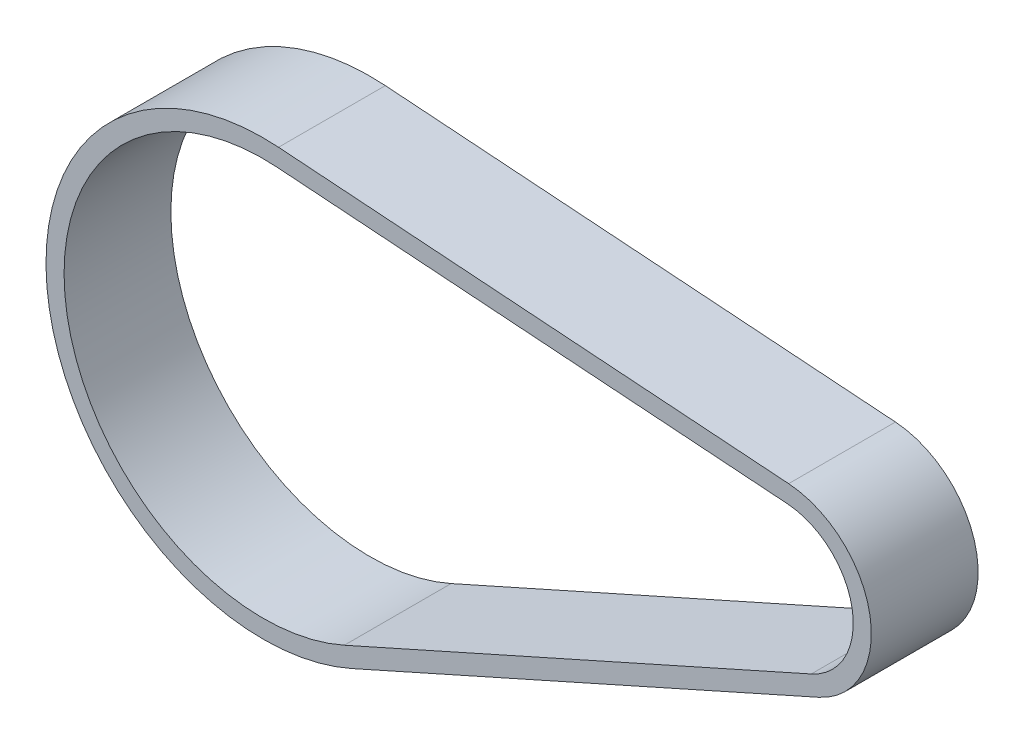
ISO-10303-21;
HEADER;
FILE_DESCRIPTION(('STEP AP214'),'2;1');
FILE_NAME('part.step','',(''),(''),'','','');
FILE_SCHEMA(('AUTOMOTIVE_DESIGN { 1 0 10303 214 1 1 1 1 }'));
ENDSEC;
DATA;
#1=APPLICATION_CONTEXT('core data for automotive mechanical design processes');
#2=APPLICATION_PROTOCOL_DEFINITION('international standard','automotive_design',2000,#1);
#3=PRODUCT_CONTEXT('',#1,'mechanical');
#4=PRODUCT('Part','Part','',(#3));
#5=PRODUCT_RELATED_PRODUCT_CATEGORY('part','',(#4));
#6=PRODUCT_DEFINITION_FORMATION('','',#4);
#7=PRODUCT_DEFINITION_CONTEXT('part definition',#1,'design');
#8=PRODUCT_DEFINITION('design','',#6,#7);
#9=PRODUCT_DEFINITION_SHAPE('','',#8);
#10=(LENGTH_UNIT() NAMED_UNIT(*) SI_UNIT(.MILLI.,.METRE.));
#11=(NAMED_UNIT(*) PLANE_ANGLE_UNIT() SI_UNIT($,.RADIAN.));
#12=(NAMED_UNIT(*) SI_UNIT($,.STERADIAN.) SOLID_ANGLE_UNIT());
#13=UNCERTAINTY_MEASURE_WITH_UNIT(LENGTH_MEASURE(1.E-05),#10,'distance_accuracy_value','');
#14=(GEOMETRIC_REPRESENTATION_CONTEXT(3) GLOBAL_UNCERTAINTY_ASSIGNED_CONTEXT((#13)) GLOBAL_UNIT_ASSIGNED_CONTEXT((#10,
#11,#12)) REPRESENTATION_CONTEXT('',''));
#15=CARTESIAN_POINT('',(0.,0.,0.));
#16=DIRECTION('',(0.,0.,1.));
#17=DIRECTION('',(1.,0.,0.));
#18=AXIS2_PLACEMENT_3D('',#15,#16,#17);
#19=CARTESIAN_POINT('',(0.,0.,-15.));
#20=DIRECTION('',(0.,0.,1.));
#21=DIRECTION('',(1.,0.,0.));
#22=AXIS2_PLACEMENT_3D('',#19,#20,#21);
#23=CYLINDRICAL_SURFACE('',#22,30.5);
#24=CARTESIAN_POINT('',(0.,0.,0.));
#25=DIRECTION('',(0.,0.,1.));
#26=DIRECTION('',(-1.,0.,0.));
#27=AXIS2_PLACEMENT_3D('',#24,#25,#26);
#28=CIRCLE('',#27,30.5);
#29=CARTESIAN_POINT('',(2.16385984295475,30.423144324347,0.));
#30=VERTEX_POINT('',#29);
#31=CARTESIAN_POINT('',(12.4386913090696,-27.8483205690698,0.));
#32=VERTEX_POINT('',#31);
#33=EDGE_CURVE('E154',#30,#32,#28,.T.);
#34=ORIENTED_EDGE('',*,*,#33,.F.);
#35=DIRECTION('',(0.,0.,1.));
#36=VECTOR('',#35,1.);
#37=CARTESIAN_POINT('',(2.16385984295475,30.423144324347,-15.));
#38=LINE('',#37,#36);
#39=CARTESIAN_POINT('',(2.16385984295475,30.423144324347,-15.));
#40=VERTEX_POINT('',#39);
#41=EDGE_CURVE('E12',#40,#30,#38,.T.);
#42=ORIENTED_EDGE('',*,*,#41,.F.);
#43=CARTESIAN_POINT('',(0.,0.,-15.));
#44=DIRECTION('',(0.,0.,1.));
#45=DIRECTION('',(-1.,0.,0.));
#46=AXIS2_PLACEMENT_3D('',#43,#44,#45);
#47=CIRCLE('',#46,30.5);
#48=CARTESIAN_POINT('',(12.4386913090696,-27.8483205690698,-15.));
#49=VERTEX_POINT('',#48);
#50=EDGE_CURVE('E158',#40,#49,#47,.T.);
#51=ORIENTED_EDGE('',*,*,#50,.T.);
#52=DIRECTION('',(0.,0.,1.));
#53=VECTOR('',#52,1.);
#54=CARTESIAN_POINT('',(12.4386913090696,-27.8483205690698,-15.));
#55=LINE('',#54,#53);
#56=EDGE_CURVE('E59',#49,#32,#55,.T.);
#57=ORIENTED_EDGE('',*,*,#56,.T.);
#58=EDGE_LOOP('',(#34,#42,#51,#57));
#59=FACE_BOUND('',#58,.T.);
#60=ADVANCED_FACE('F56',(#59),#23,.T.);
#61=CARTESIAN_POINT('',(2.16385984295475,30.423144324347,-15.));
#62=DIRECTION('',(0.0709462243591721,0.997480141781869,0.));
#63=DIRECTION('',(-0.997480141781869,0.0709462243591721,0.));
#64=AXIS2_PLACEMENT_3D('',#61,#62,#63);
#65=PLANE('',#64);
#66=DIRECTION('',(-0.997480141781869,0.0709462243591721,0.));
#67=VECTOR('',#66,1.);
#68=CARTESIAN_POINT('',(2.16385984295475,30.423144324347,0.));
#69=LINE('',#68,#67);
#70=CARTESIAN_POINT('',(73.8118419150438,25.3271493285088,0.));
#71=VERTEX_POINT('',#70);
#72=EDGE_CURVE('E162',#71,#30,#69,.T.);
#73=ORIENTED_EDGE('',*,*,#72,.F.);
#74=DIRECTION('',(0.,0.,1.));
#75=VECTOR('',#74,1.);
#76=CARTESIAN_POINT('',(73.8118419150438,25.3271493285088,-15.));
#77=LINE('',#76,#75);
#78=CARTESIAN_POINT('',(73.8118419150438,25.3271493285088,-15.));
#79=VERTEX_POINT('',#78);
#80=EDGE_CURVE('E64',#79,#71,#77,.T.);
#81=ORIENTED_EDGE('',*,*,#80,.F.);
#82=DIRECTION('',(-0.997480141781869,0.0709462243591721,0.));
#83=VECTOR('',#82,1.);
#84=CARTESIAN_POINT('',(2.16385984295475,30.423144324347,-15.));
#85=LINE('',#84,#83);
#86=EDGE_CURVE('E168',#79,#40,#85,.T.);
#87=ORIENTED_EDGE('',*,*,#86,.T.);
#88=ORIENTED_EDGE('',*,*,#41,.T.);
#89=EDGE_LOOP('',(#73,#81,#87,#88));
#90=FACE_BOUND('',#89,.T.);
#91=ADVANCED_FACE('F194',(#90),#65,.T.);
#92=CARTESIAN_POINT('',(72.9250141105541,12.8586475562355,-15.));
#93=DIRECTION('',(0.,0.,1.));
#94=DIRECTION('',(1.,0.,0.));
#95=AXIS2_PLACEMENT_3D('',#92,#93,#94);
#96=CYLINDRICAL_SURFACE('',#95,12.5);
#97=CARTESIAN_POINT('',(72.9250141105541,12.8586475562355,0.));
#98=DIRECTION('',(0.,0.,1.));
#99=DIRECTION('',(-1.,0.,0.));
#100=AXIS2_PLACEMENT_3D('',#97,#98,#99);
#101=CIRCLE('',#100,12.5);
#102=CARTESIAN_POINT('',(78.0228384175499,1.44540142137079,0.));
#103=VERTEX_POINT('',#102);
#104=EDGE_CURVE('E176',#103,#71,#101,.T.);
#105=ORIENTED_EDGE('',*,*,#104,.F.);
#106=DIRECTION('',(0.,0.,1.));
#107=VECTOR('',#106,1.);
#108=CARTESIAN_POINT('',(78.0228384175499,1.44540142137079,-15.));
#109=LINE('',#108,#107);
#110=CARTESIAN_POINT('',(78.0228384175499,1.44540142137079,-15.));
#111=VERTEX_POINT('',#110);
#112=EDGE_CURVE('E181',#111,#103,#109,.T.);
#113=ORIENTED_EDGE('',*,*,#112,.F.);
#114=CARTESIAN_POINT('',(72.9250141105541,12.8586475562355,-15.));
#115=DIRECTION('',(0.,0.,1.));
#116=DIRECTION('',(-1.,0.,0.));
#117=AXIS2_PLACEMENT_3D('',#114,#115,#116);
#118=CIRCLE('',#117,12.5);
#119=EDGE_CURVE('E165',#111,#79,#118,.T.);
#120=ORIENTED_EDGE('',*,*,#119,.T.);
#121=ORIENTED_EDGE('',*,*,#80,.T.);
#122=EDGE_LOOP('',(#105,#113,#120,#121));
#123=FACE_BOUND('',#122,.T.);
#124=ADVANCED_FACE('F198',(#123),#96,.T.);
#125=CARTESIAN_POINT('',(78.0228384175499,1.44540142137079,-15.));
#126=DIRECTION('',(0.40782594455966,-0.913059690789173,0.));
#127=DIRECTION('',(0.913059690789173,0.407825944559661,0.));
#128=AXIS2_PLACEMENT_3D('',#125,#126,#127);
#129=PLANE('',#128);
#130=DIRECTION('',(0.913059690789173,0.40782594455966,0.));
#131=VECTOR('',#130,1.);
#132=CARTESIAN_POINT('',(78.0228384175499,1.44540142137079,0.));
#133=LINE('',#132,#131);
#134=EDGE_CURVE('E173',#32,#103,#133,.T.);
#135=ORIENTED_EDGE('',*,*,#134,.F.);
#136=ORIENTED_EDGE('',*,*,#56,.F.);
#137=DIRECTION('',(0.913059690789173,0.40782594455966,0.));
#138=VECTOR('',#137,1.);
#139=CARTESIAN_POINT('',(78.0228384175499,1.44540142137079,-15.));
#140=LINE('',#139,#138);
#141=EDGE_CURVE('E161',#49,#111,#140,.T.);
#142=ORIENTED_EDGE('',*,*,#141,.T.);
#143=ORIENTED_EDGE('',*,*,#112,.T.);
#144=EDGE_LOOP('',(#135,#136,#142,#143));
#145=FACE_BOUND('',#144,.T.);
#146=ADVANCED_FACE('F189',(#145),#129,.T.);
#147=CARTESIAN_POINT('',(0.,0.,-15.));
#148=DIRECTION('',(0.,0.,1.));
#149=DIRECTION('',(1.,0.,0.));
#150=AXIS2_PLACEMENT_3D('',#147,#148,#149);
#151=PLANE('',#150);
#152=DIRECTION('',(-0.997480141781869,0.0709462243591721,0.));
#153=VECTOR('',#152,1.);
#154=CARTESIAN_POINT('',(1.98365643308245,27.8895447642211,-15.));
#155=LINE('',#154,#153);
#156=CARTESIAN_POINT('',(73.6316385051715,22.7935497683829,-15.));
#157=VERTEX_POINT('',#156);
#158=CARTESIAN_POINT('',(1.98365643308245,27.8895447642211,-15.));
#159=VERTEX_POINT('',#158);
#160=EDGE_CURVE('E129',#157,#159,#155,.T.);
#161=ORIENTED_EDGE('',*,*,#160,.T.);
#162=CARTESIAN_POINT('',(0.,0.,-15.));
#163=DIRECTION('',(0.,0.,-1.));
#164=DIRECTION('',(-1.,0.,0.));
#165=AXIS2_PLACEMENT_3D('',#162,#163,#164);
#166=CIRCLE('',#165,27.96);
#167=CARTESIAN_POINT('',(11.4028134098881,-25.5291489544653,-15.));
#168=VERTEX_POINT('',#167);
#169=EDGE_CURVE('E123',#159,#168,#166,.F.);
#170=ORIENTED_EDGE('',*,*,#169,.T.);
#171=DIRECTION('',(0.913059690789173,0.40782594455966,0.));
#172=VECTOR('',#171,1.);
#173=CARTESIAN_POINT('',(11.4028134098881,-25.5291489544653,-15.));
#174=LINE('',#173,#172);
#175=CARTESIAN_POINT('',(76.9869605183683,3.7645730359753,-15.));
#176=VERTEX_POINT('',#175);
#177=EDGE_CURVE('E132',#168,#176,#174,.T.);
#178=ORIENTED_EDGE('',*,*,#177,.T.);
#179=CARTESIAN_POINT('',(72.9250141105541,12.8586475562355,-15.));
#180=DIRECTION('',(0.,0.,-1.));
#181=DIRECTION('',(-1.,0.,0.));
#182=AXIS2_PLACEMENT_3D('',#179,#180,#181);
#183=CIRCLE('',#182,9.96);
#184=EDGE_CURVE('E72',#176,#157,#183,.F.);
#185=ORIENTED_EDGE('',*,*,#184,.T.);
#186=EDGE_LOOP('',(#161,#170,#178,#185));
#187=FACE_BOUND('',#186,.T.);
#188=ORIENTED_EDGE('',*,*,#50,.F.);
#189=ORIENTED_EDGE('',*,*,#86,.F.);
#190=ORIENTED_EDGE('',*,*,#119,.F.);
#191=ORIENTED_EDGE('',*,*,#141,.F.);
#192=EDGE_LOOP('',(#188,#189,#190,#191));
#193=FACE_BOUND('',#192,.T.);
#194=ADVANCED_FACE('F136',(#187,#193),#151,.F.);
#195=CARTESIAN_POINT('',(0.,0.,0.));
#196=DIRECTION('',(0.,0.,1.));
#197=DIRECTION('',(1.,0.,0.));
#198=AXIS2_PLACEMENT_3D('',#195,#196,#197);
#199=PLANE('',#198);
#200=CARTESIAN_POINT('',(0.,0.,0.));
#201=DIRECTION('',(0.,0.,-1.));
#202=DIRECTION('',(-1.,0.,0.));
#203=AXIS2_PLACEMENT_3D('',#200,#201,#202);
#204=CIRCLE('',#203,27.96);
#205=CARTESIAN_POINT('',(1.98365643308245,27.8895447642211,0.));
#206=VERTEX_POINT('',#205);
#207=CARTESIAN_POINT('',(11.4028134098881,-25.5291489544653,0.));
#208=VERTEX_POINT('',#207);
#209=EDGE_CURVE('E80',#206,#208,#204,.F.);
#210=ORIENTED_EDGE('',*,*,#209,.F.);
#211=DIRECTION('',(-0.997480141781869,0.0709462243591721,0.));
#212=VECTOR('',#211,1.);
#213=CARTESIAN_POINT('',(1.98365643308245,27.8895447642211,0.));
#214=LINE('',#213,#212);
#215=CARTESIAN_POINT('',(73.6316385051715,22.7935497683829,0.));
#216=VERTEX_POINT('',#215);
#217=EDGE_CURVE('E139',#216,#206,#214,.T.);
#218=ORIENTED_EDGE('',*,*,#217,.F.);
#219=CARTESIAN_POINT('',(72.9250141105541,12.8586475562355,0.));
#220=DIRECTION('',(0.,0.,-1.));
#221=DIRECTION('',(-1.,0.,0.));
#222=AXIS2_PLACEMENT_3D('',#219,#220,#221);
#223=CIRCLE('',#222,9.96);
#224=CARTESIAN_POINT('',(76.9869605183683,3.76457303597529,0.));
#225=VERTEX_POINT('',#224);
#226=EDGE_CURVE('E142',#225,#216,#223,.F.);
#227=ORIENTED_EDGE('',*,*,#226,.F.);
#228=DIRECTION('',(0.913059690789173,0.40782594455966,0.));
#229=VECTOR('',#228,1.);
#230=CARTESIAN_POINT('',(11.4028134098881,-25.5291489544653,0.));
#231=LINE('',#230,#229);
#232=EDGE_CURVE('E148',#208,#225,#231,.T.);
#233=ORIENTED_EDGE('',*,*,#232,.F.);
#234=EDGE_LOOP('',(#210,#218,#227,#233));
#235=FACE_BOUND('',#234,.T.);
#236=ORIENTED_EDGE('',*,*,#33,.T.);
#237=ORIENTED_EDGE('',*,*,#134,.T.);
#238=ORIENTED_EDGE('',*,*,#104,.T.);
#239=ORIENTED_EDGE('',*,*,#72,.T.);
#240=EDGE_LOOP('',(#236,#237,#238,#239));
#241=FACE_BOUND('',#240,.T.);
#242=ADVANCED_FACE('F191',(#235,#241),#199,.T.);
#243=CARTESIAN_POINT('',(0.,0.,-15.));
#244=DIRECTION('',(0.,0.,1.));
#245=DIRECTION('',(1.,0.,0.));
#246=AXIS2_PLACEMENT_3D('',#243,#244,#245);
#247=CYLINDRICAL_SURFACE('',#246,27.96);
#248=ORIENTED_EDGE('',*,*,#209,.T.);
#249=DIRECTION('',(0.,0.,1.));
#250=VECTOR('',#249,1.);
#251=CARTESIAN_POINT('',(11.4028134098881,-25.5291489544653,-15.));
#252=LINE('',#251,#250);
#253=EDGE_CURVE('E119',#168,#208,#252,.T.);
#254=ORIENTED_EDGE('',*,*,#253,.F.);
#255=ORIENTED_EDGE('',*,*,#169,.F.);
#256=DIRECTION('',(0.,0.,1.));
#257=VECTOR('',#256,1.);
#258=CARTESIAN_POINT('',(1.98365643308245,27.8895447642211,-15.));
#259=LINE('',#258,#257);
#260=EDGE_CURVE('E152',#159,#206,#259,.T.);
#261=ORIENTED_EDGE('',*,*,#260,.T.);
#262=EDGE_LOOP('',(#248,#254,#255,#261));
#263=FACE_BOUND('',#262,.T.);
#264=ADVANCED_FACE('F121',(#263),#247,.F.);
#265=CARTESIAN_POINT('',(1.98365643308245,27.8895447642211,-15.));
#266=DIRECTION('',(0.0709462243591721,0.997480141781869,0.));
#267=DIRECTION('',(-0.997480141781869,0.0709462243591721,0.));
#268=AXIS2_PLACEMENT_3D('',#265,#266,#267);
#269=PLANE('',#268);
#270=ORIENTED_EDGE('',*,*,#217,.T.);
#271=ORIENTED_EDGE('',*,*,#260,.F.);
#272=ORIENTED_EDGE('',*,*,#160,.F.);
#273=DIRECTION('',(0.,0.,1.));
#274=VECTOR('',#273,1.);
#275=CARTESIAN_POINT('',(73.6316385051715,22.7935497683829,-15.));
#276=LINE('',#275,#274);
#277=EDGE_CURVE('E155',#157,#216,#276,.T.);
#278=ORIENTED_EDGE('',*,*,#277,.T.);
#279=EDGE_LOOP('',(#270,#271,#272,#278));
#280=FACE_BOUND('',#279,.T.);
#281=ADVANCED_FACE('F249',(#280),#269,.F.);
#282=CARTESIAN_POINT('',(72.9250141105541,12.8586475562355,-15.));
#283=DIRECTION('',(0.,0.,1.));
#284=DIRECTION('',(1.,0.,0.));
#285=AXIS2_PLACEMENT_3D('',#282,#283,#284);
#286=CYLINDRICAL_SURFACE('',#285,9.96);
#287=ORIENTED_EDGE('',*,*,#226,.T.);
#288=ORIENTED_EDGE('',*,*,#277,.F.);
#289=ORIENTED_EDGE('',*,*,#184,.F.);
#290=DIRECTION('',(0.,0.,1.));
#291=VECTOR('',#290,1.);
#292=CARTESIAN_POINT('',(76.9869605183683,3.76457303597529,-15.));
#293=LINE('',#292,#291);
#294=EDGE_CURVE('E128',#176,#225,#293,.T.);
#295=ORIENTED_EDGE('',*,*,#294,.T.);
#296=EDGE_LOOP('',(#287,#288,#289,#295));
#297=FACE_BOUND('',#296,.T.);
#298=ADVANCED_FACE('F258',(#297),#286,.F.);
#299=CARTESIAN_POINT('',(11.4028134098881,-25.5291489544653,-15.));
#300=DIRECTION('',(0.40782594455966,-0.913059690789173,0.));
#301=DIRECTION('',(0.913059690789173,0.40782594455966,0.));
#302=AXIS2_PLACEMENT_3D('',#299,#300,#301);
#303=PLANE('',#302);
#304=ORIENTED_EDGE('',*,*,#232,.T.);
#305=ORIENTED_EDGE('',*,*,#294,.F.);
#306=ORIENTED_EDGE('',*,*,#177,.F.);
#307=ORIENTED_EDGE('',*,*,#253,.T.);
#308=EDGE_LOOP('',(#304,#305,#306,#307));
#309=FACE_BOUND('',#308,.T.);
#310=ADVANCED_FACE('F133',(#309),#303,.F.);
#311=CLOSED_SHELL('',(#60,#91,#124,#146,#194,#242,#264,#281,#298,#310));
#312=MANIFOLD_SOLID_BREP('B2',#311);
#313=ADVANCED_BREP_SHAPE_REPRESENTATION('',(#18,#312),#14);
#314=SHAPE_DEFINITION_REPRESENTATION(#9,#313);
ENDSEC;
END-ISO-10303-21;
